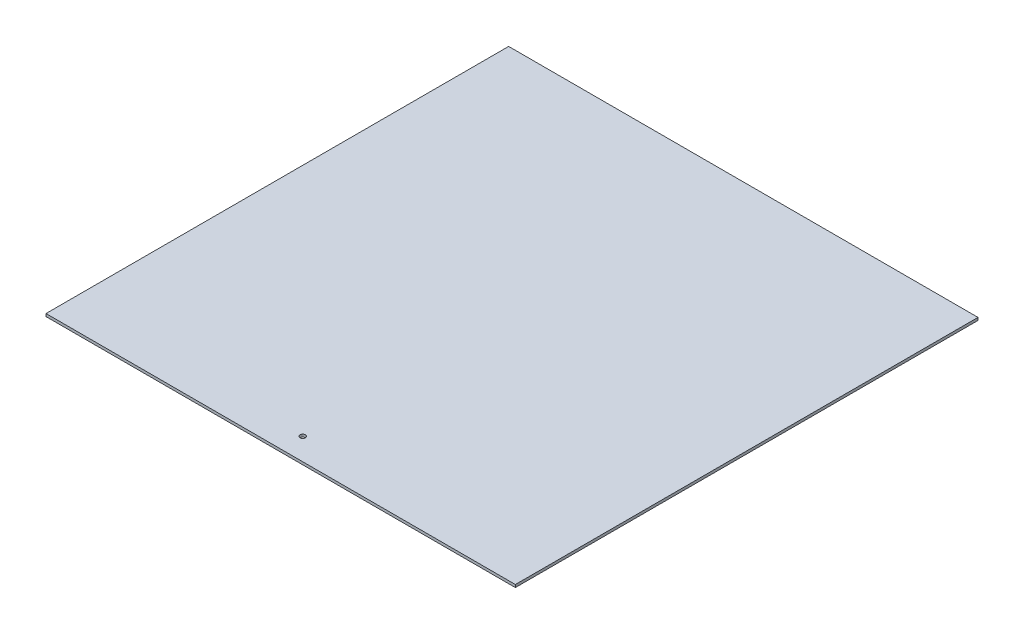
ISO-10303-21;
HEADER;
FILE_DESCRIPTION(('STEP AP214'),'2;1');
FILE_NAME('part.step','',(''),(''),'','','');
FILE_SCHEMA(('AUTOMOTIVE_DESIGN { 1 0 10303 214 1 1 1 1 }'));
ENDSEC;
DATA;
#1=APPLICATION_CONTEXT('core data for automotive mechanical design processes');
#2=APPLICATION_PROTOCOL_DEFINITION('international standard','automotive_design',2000,#1);
#3=PRODUCT_CONTEXT('',#1,'mechanical');
#4=PRODUCT('Part','Part','',(#3));
#5=PRODUCT_RELATED_PRODUCT_CATEGORY('part','',(#4));
#6=PRODUCT_DEFINITION_FORMATION('','',#4);
#7=PRODUCT_DEFINITION_CONTEXT('part definition',#1,'design');
#8=PRODUCT_DEFINITION('design','',#6,#7);
#9=PRODUCT_DEFINITION_SHAPE('','',#8);
#10=(LENGTH_UNIT() NAMED_UNIT(*) SI_UNIT(.MILLI.,.METRE.));
#11=(NAMED_UNIT(*) PLANE_ANGLE_UNIT() SI_UNIT($,.RADIAN.));
#12=(NAMED_UNIT(*) SI_UNIT($,.STERADIAN.) SOLID_ANGLE_UNIT());
#13=UNCERTAINTY_MEASURE_WITH_UNIT(LENGTH_MEASURE(1.E-05),#10,'distance_accuracy_value','');
#14=(GEOMETRIC_REPRESENTATION_CONTEXT(3) GLOBAL_UNCERTAINTY_ASSIGNED_CONTEXT((#13)) GLOBAL_UNIT_ASSIGNED_CONTEXT((#10,
#11,#12)) REPRESENTATION_CONTEXT('',''));
#15=CARTESIAN_POINT('',(0.,0.,0.));
#16=DIRECTION('',(0.,0.,1.));
#17=DIRECTION('',(1.,0.,0.));
#18=AXIS2_PLACEMENT_3D('',#15,#16,#17);
#19=CARTESIAN_POINT('',(0.,2.,0.));
#20=DIRECTION('',(0.,-1.,0.));
#21=DIRECTION('',(0.,0.,-1.));
#22=AXIS2_PLACEMENT_3D('',#19,#20,#21);
#23=PLANE('',#22);
#24=DIRECTION('',(0.,0.,1.));
#25=VECTOR('',#24,1.);
#26=CARTESIAN_POINT('',(-175.,2.,173.557091064325));
#27=LINE('',#26,#25);
#28=CARTESIAN_POINT('',(-175.,2.,-171.442908935675));
#29=VERTEX_POINT('',#28);
#30=CARTESIAN_POINT('',(-175.,2.,173.557091064325));
#31=VERTEX_POINT('',#30);
#32=EDGE_CURVE('E102',#29,#31,#27,.T.);
#33=ORIENTED_EDGE('',*,*,#32,.T.);
#34=DIRECTION('',(1.,0.,0.));
#35=VECTOR('',#34,1.);
#36=CARTESIAN_POINT('',(-175.,2.,173.557091064325));
#37=LINE('',#36,#35);
#38=CARTESIAN_POINT('',(175.,2.,173.557091064325));
#39=VERTEX_POINT('',#38);
#40=EDGE_CURVE('E97',#31,#39,#37,.T.);
#41=ORIENTED_EDGE('',*,*,#40,.T.);
#42=DIRECTION('',(0.,0.,-1.));
#43=VECTOR('',#42,1.);
#44=CARTESIAN_POINT('',(175.,2.,173.557091064325));
#45=LINE('',#44,#43);
#46=CARTESIAN_POINT('',(175.,2.,-171.442908935675));
#47=VERTEX_POINT('',#46);
#48=EDGE_CURVE('E100',#39,#47,#45,.T.);
#49=ORIENTED_EDGE('',*,*,#48,.T.);
#50=DIRECTION('',(-1.,0.,0.));
#51=VECTOR('',#50,1.);
#52=CARTESIAN_POINT('',(-175.,2.,-171.442908935675));
#53=LINE('',#52,#51);
#54=EDGE_CURVE('E67',#47,#29,#53,.T.);
#55=ORIENTED_EDGE('',*,*,#54,.T.);
#56=EDGE_LOOP('',(#33,#41,#49,#55));
#57=FACE_BOUND('',#56,.T.);
#58=CARTESIAN_POINT('',(0.,2.,157.09218888717));
#59=DIRECTION('',(0.,1.,0.));
#60=DIRECTION('',(0.,0.,1.));
#61=AXIS2_PLACEMENT_3D('',#58,#59,#60);
#62=CIRCLE('',#61,2.);
#63=CARTESIAN_POINT('',(0.,2.,159.09218888717));
#64=VERTEX_POINT('',#63);
#65=EDGE_CURVE('E122',#64,#64,#62,.T.);
#66=ORIENTED_EDGE('',*,*,#65,.F.);
#67=EDGE_LOOP('',(#66));
#68=FACE_BOUND('',#67,.T.);
#69=ADVANCED_FACE('F49',(#57,#68),#23,.F.);
#70=CARTESIAN_POINT('',(0.,0.,0.));
#71=DIRECTION('',(0.,-1.,0.));
#72=DIRECTION('',(0.,0.,-1.));
#73=AXIS2_PLACEMENT_3D('',#70,#71,#72);
#74=PLANE('',#73);
#75=DIRECTION('',(0.,0.,1.));
#76=VECTOR('',#75,1.);
#77=CARTESIAN_POINT('',(-175.,0.,173.557091064325));
#78=LINE('',#77,#76);
#79=CARTESIAN_POINT('',(-175.,0.,-171.442908935675));
#80=VERTEX_POINT('',#79);
#81=CARTESIAN_POINT('',(-175.,0.,173.557091064325));
#82=VERTEX_POINT('',#81);
#83=EDGE_CURVE('E118',#80,#82,#78,.T.);
#84=ORIENTED_EDGE('',*,*,#83,.F.);
#85=DIRECTION('',(-1.,0.,0.));
#86=VECTOR('',#85,1.);
#87=CARTESIAN_POINT('',(-175.,0.,-171.442908935675));
#88=LINE('',#87,#86);
#89=CARTESIAN_POINT('',(175.,0.,-171.442908935675));
#90=VERTEX_POINT('',#89);
#91=EDGE_CURVE('E90',#90,#80,#88,.T.);
#92=ORIENTED_EDGE('',*,*,#91,.F.);
#93=DIRECTION('',(0.,0.,-1.));
#94=VECTOR('',#93,1.);
#95=CARTESIAN_POINT('',(175.,0.,173.557091064325));
#96=LINE('',#95,#94);
#97=CARTESIAN_POINT('',(175.,0.,173.557091064325));
#98=VERTEX_POINT('',#97);
#99=EDGE_CURVE('E84',#98,#90,#96,.T.);
#100=ORIENTED_EDGE('',*,*,#99,.F.);
#101=DIRECTION('',(1.,0.,0.));
#102=VECTOR('',#101,1.);
#103=CARTESIAN_POINT('',(-175.,0.,173.557091064325));
#104=LINE('',#103,#102);
#105=EDGE_CURVE('E107',#82,#98,#104,.T.);
#106=ORIENTED_EDGE('',*,*,#105,.F.);
#107=EDGE_LOOP('',(#84,#92,#100,#106));
#108=FACE_BOUND('',#107,.T.);
#109=CARTESIAN_POINT('',(0.,0.,157.09218888717));
#110=DIRECTION('',(0.,1.,0.));
#111=DIRECTION('',(0.,0.,1.));
#112=AXIS2_PLACEMENT_3D('',#109,#110,#111);
#113=CIRCLE('',#112,2.);
#114=CARTESIAN_POINT('',(0.,0.,159.09218888717));
#115=VERTEX_POINT('',#114);
#116=EDGE_CURVE('E140',#115,#115,#113,.T.);
#117=ORIENTED_EDGE('',*,*,#116,.T.);
#118=EDGE_LOOP('',(#117));
#119=FACE_BOUND('',#118,.T.);
#120=ADVANCED_FACE('F135',(#108,#119),#74,.T.);
#121=CARTESIAN_POINT('',(-175.,2.,173.557091064325));
#122=DIRECTION('',(1.,0.,0.));
#123=DIRECTION('',(0.,0.,-1.));
#124=AXIS2_PLACEMENT_3D('',#121,#122,#123);
#125=PLANE('',#124);
#126=ORIENTED_EDGE('',*,*,#83,.T.);
#127=DIRECTION('',(0.,-1.,0.));
#128=VECTOR('',#127,1.);
#129=CARTESIAN_POINT('',(-175.,2.,173.557091064325));
#130=LINE('',#129,#128);
#131=EDGE_CURVE('E11',#31,#82,#130,.T.);
#132=ORIENTED_EDGE('',*,*,#131,.F.);
#133=ORIENTED_EDGE('',*,*,#32,.F.);
#134=DIRECTION('',(0.,-1.,0.));
#135=VECTOR('',#134,1.);
#136=CARTESIAN_POINT('',(-175.,2.,-171.442908935675));
#137=LINE('',#136,#135);
#138=EDGE_CURVE('E114',#29,#80,#137,.T.);
#139=ORIENTED_EDGE('',*,*,#138,.T.);
#140=EDGE_LOOP('',(#126,#132,#133,#139));
#141=FACE_BOUND('',#140,.T.);
#142=ADVANCED_FACE('F51',(#141),#125,.F.);
#143=CARTESIAN_POINT('',(-175.,2.,173.557091064325));
#144=DIRECTION('',(0.,0.,-1.));
#145=DIRECTION('',(-1.,0.,0.));
#146=AXIS2_PLACEMENT_3D('',#143,#144,#145);
#147=PLANE('',#146);
#148=ORIENTED_EDGE('',*,*,#105,.T.);
#149=DIRECTION('',(0.,-1.,0.));
#150=VECTOR('',#149,1.);
#151=CARTESIAN_POINT('',(175.,2.,173.557091064325));
#152=LINE('',#151,#150);
#153=EDGE_CURVE('E59',#39,#98,#152,.T.);
#154=ORIENTED_EDGE('',*,*,#153,.F.);
#155=ORIENTED_EDGE('',*,*,#40,.F.);
#156=ORIENTED_EDGE('',*,*,#131,.T.);
#157=EDGE_LOOP('',(#148,#154,#155,#156));
#158=FACE_BOUND('',#157,.T.);
#159=ADVANCED_FACE('F106',(#158),#147,.F.);
#160=CARTESIAN_POINT('',(175.,2.,173.557091064325));
#161=DIRECTION('',(-1.,0.,0.));
#162=DIRECTION('',(0.,0.,1.));
#163=AXIS2_PLACEMENT_3D('',#160,#161,#162);
#164=PLANE('',#163);
#165=ORIENTED_EDGE('',*,*,#99,.T.);
#166=DIRECTION('',(0.,-1.,0.));
#167=VECTOR('',#166,1.);
#168=CARTESIAN_POINT('',(175.,2.,-171.442908935675));
#169=LINE('',#168,#167);
#170=EDGE_CURVE('E109',#47,#90,#169,.T.);
#171=ORIENTED_EDGE('',*,*,#170,.F.);
#172=ORIENTED_EDGE('',*,*,#48,.F.);
#173=ORIENTED_EDGE('',*,*,#153,.T.);
#174=EDGE_LOOP('',(#165,#171,#172,#173));
#175=FACE_BOUND('',#174,.T.);
#176=ADVANCED_FACE('F110',(#175),#164,.F.);
#177=CARTESIAN_POINT('',(-175.,2.,-171.442908935675));
#178=DIRECTION('',(0.,0.,1.));
#179=DIRECTION('',(1.,0.,0.));
#180=AXIS2_PLACEMENT_3D('',#177,#178,#179);
#181=PLANE('',#180);
#182=ORIENTED_EDGE('',*,*,#91,.T.);
#183=ORIENTED_EDGE('',*,*,#138,.F.);
#184=ORIENTED_EDGE('',*,*,#54,.F.);
#185=ORIENTED_EDGE('',*,*,#170,.T.);
#186=EDGE_LOOP('',(#182,#183,#184,#185));
#187=FACE_BOUND('',#186,.T.);
#188=ADVANCED_FACE('F132',(#187),#181,.F.);
#189=CARTESIAN_POINT('',(0.,2.,157.09218888717));
#190=DIRECTION('',(0.,-1.,0.));
#191=DIRECTION('',(0.,0.,-1.));
#192=AXIS2_PLACEMENT_3D('',#189,#190,#191);
#193=CYLINDRICAL_SURFACE('',#192,2.);
#194=ORIENTED_EDGE('',*,*,#65,.T.);
#195=EDGE_LOOP('',(#194));
#196=FACE_BOUND('',#195,.T.);
#197=ORIENTED_EDGE('',*,*,#116,.F.);
#198=EDGE_LOOP('',(#197));
#199=FACE_BOUND('',#198,.T.);
#200=ADVANCED_FACE('F148',(#196,#199),#193,.F.);
#201=CLOSED_SHELL('',(#69,#120,#142,#159,#176,#188,#200));
#202=MANIFOLD_SOLID_BREP('B2',#201);
#203=ADVANCED_BREP_SHAPE_REPRESENTATION('',(#18,#202),#14);
#204=SHAPE_DEFINITION_REPRESENTATION(#9,#203);
ENDSEC;
END-ISO-10303-21;
